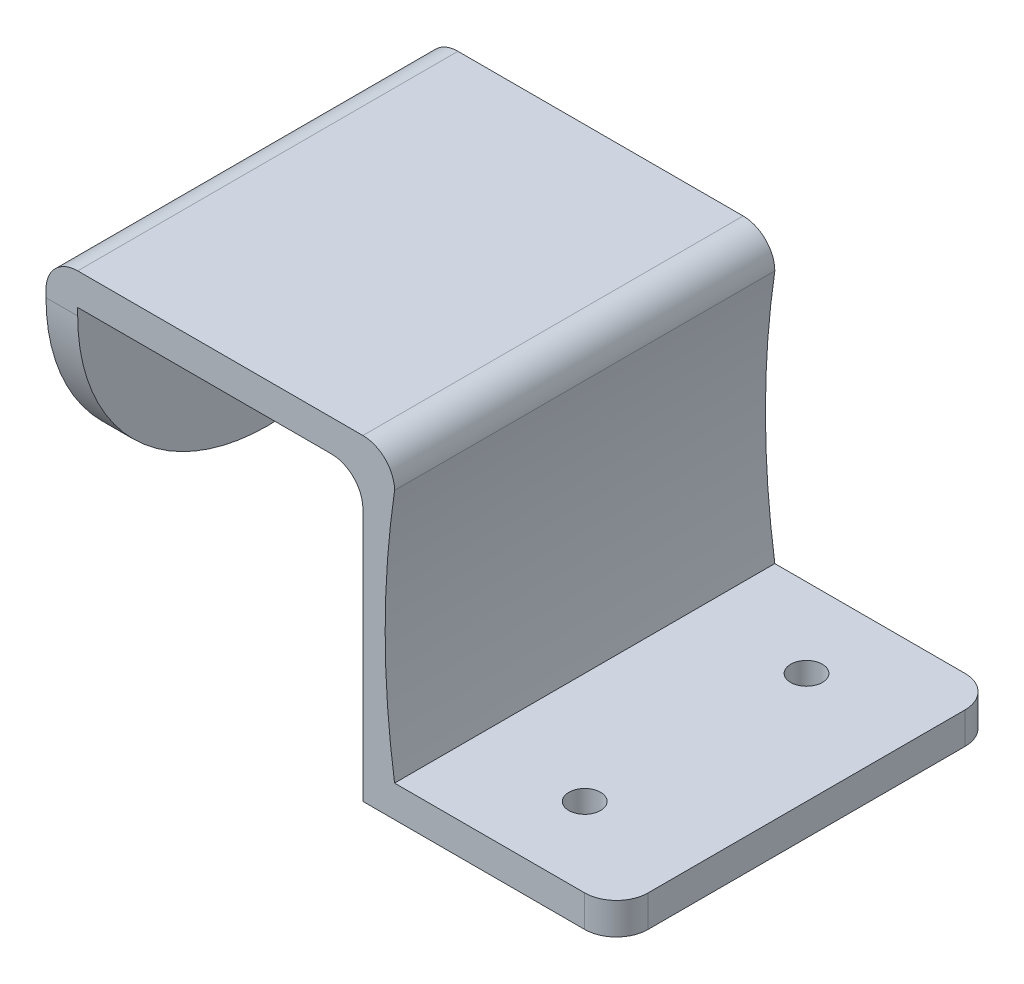
ISO-10303-21;
HEADER;
FILE_DESCRIPTION(('STEP AP214'),'2;1');
FILE_NAME('part.step','',(''),(''),'','','');
FILE_SCHEMA(('AUTOMOTIVE_DESIGN { 1 0 10303 214 1 1 1 1 }'));
ENDSEC;
DATA;
#1=APPLICATION_CONTEXT('core data for automotive mechanical design processes');
#2=APPLICATION_PROTOCOL_DEFINITION('international standard','automotive_design',2000,#1);
#3=PRODUCT_CONTEXT('',#1,'mechanical');
#4=PRODUCT('Part','Part','',(#3));
#5=PRODUCT_RELATED_PRODUCT_CATEGORY('part','',(#4));
#6=PRODUCT_DEFINITION_FORMATION('','',#4);
#7=PRODUCT_DEFINITION_CONTEXT('part definition',#1,'design');
#8=PRODUCT_DEFINITION('design','',#6,#7);
#9=PRODUCT_DEFINITION_SHAPE('','',#8);
#10=(LENGTH_UNIT() NAMED_UNIT(*) SI_UNIT(.MILLI.,.METRE.));
#11=(NAMED_UNIT(*) PLANE_ANGLE_UNIT() SI_UNIT($,.RADIAN.));
#12=(NAMED_UNIT(*) SI_UNIT($,.STERADIAN.) SOLID_ANGLE_UNIT());
#13=UNCERTAINTY_MEASURE_WITH_UNIT(LENGTH_MEASURE(1.E-05),#10,'distance_accuracy_value','');
#14=(GEOMETRIC_REPRESENTATION_CONTEXT(3) GLOBAL_UNCERTAINTY_ASSIGNED_CONTEXT((#13)) GLOBAL_UNIT_ASSIGNED_CONTEXT((#10,
#11,#12)) REPRESENTATION_CONTEXT('',''));
#15=CARTESIAN_POINT('',(0.,0.,0.));
#16=DIRECTION('',(0.,0.,1.));
#17=DIRECTION('',(1.,0.,0.));
#18=AXIS2_PLACEMENT_3D('',#15,#16,#17);
#19=CARTESIAN_POINT('',(-170.,46.9063846694511,72.));
#20=DIRECTION('',(-1.,0.,0.));
#21=DIRECTION('',(0.,0.,1.));
#22=AXIS2_PLACEMENT_3D('',#19,#20,#21);
#23=CYLINDRICAL_SURFACE('',#22,1.5);
#24=CARTESIAN_POINT('',(-170.,46.9063846694511,72.));
#25=DIRECTION('',(-1.,0.,0.));
#26=DIRECTION('',(0.,0.,1.));
#27=AXIS2_PLACEMENT_3D('',#24,#25,#26);
#28=CIRCLE('',#27,1.5);
#29=CARTESIAN_POINT('',(-170.,46.9063846694511,73.5));
#30=VERTEX_POINT('',#29);
#31=EDGE_CURVE('E297',#30,#30,#28,.T.);
#32=ORIENTED_EDGE('',*,*,#31,.F.);
#33=EDGE_LOOP('',(#32));
#34=FACE_BOUND('',#33,.T.);
#35=CARTESIAN_POINT('',(-175.,46.9063846694511,72.));
#36=DIRECTION('',(-1.,0.,0.));
#37=DIRECTION('',(0.,0.,1.));
#38=AXIS2_PLACEMENT_3D('',#35,#36,#37);
#39=CIRCLE('',#38,1.5);
#40=CARTESIAN_POINT('',(-175.,46.9063846694511,73.5));
#41=VERTEX_POINT('',#40);
#42=EDGE_CURVE('E48',#41,#41,#39,.F.);
#43=ORIENTED_EDGE('',*,*,#42,.F.);
#44=EDGE_LOOP('',(#43));
#45=FACE_BOUND('',#44,.T.);
#46=ADVANCED_FACE('F44',(#34,#45),#23,.F.);
#47=CARTESIAN_POINT('',(-170.,67.6909943602776,60.));
#48=DIRECTION('',(-1.,0.,0.));
#49=DIRECTION('',(0.,0.,1.));
#50=AXIS2_PLACEMENT_3D('',#47,#48,#49);
#51=CYLINDRICAL_SURFACE('',#50,1.5);
#52=CARTESIAN_POINT('',(-170.,67.6909943602776,60.));
#53=DIRECTION('',(-1.,0.,0.));
#54=DIRECTION('',(0.,0.,1.));
#55=AXIS2_PLACEMENT_3D('',#52,#53,#54);
#56=CIRCLE('',#55,1.5);
#57=CARTESIAN_POINT('',(-170.,67.6909943602776,61.5));
#58=VERTEX_POINT('',#57);
#59=EDGE_CURVE('E361',#58,#58,#56,.T.);
#60=ORIENTED_EDGE('',*,*,#59,.F.);
#61=EDGE_LOOP('',(#60));
#62=FACE_BOUND('',#61,.T.);
#63=CARTESIAN_POINT('',(-175.,67.6909943602776,60.));
#64=DIRECTION('',(-1.,0.,0.));
#65=DIRECTION('',(0.,0.,1.));
#66=AXIS2_PLACEMENT_3D('',#63,#64,#65);
#67=CIRCLE('',#66,1.5);
#68=CARTESIAN_POINT('',(-175.,67.6909943602776,61.5));
#69=VERTEX_POINT('',#68);
#70=EDGE_CURVE('E329',#69,#69,#67,.F.);
#71=ORIENTED_EDGE('',*,*,#70,.F.);
#72=EDGE_LOOP('',(#71));
#73=FACE_BOUND('',#72,.T.);
#74=ADVANCED_FACE('F373',(#62,#73),#51,.F.);
#75=CARTESIAN_POINT('',(-170.,46.9063846694511,48.));
#76=DIRECTION('',(-1.,0.,0.));
#77=DIRECTION('',(0.,0.,1.));
#78=AXIS2_PLACEMENT_3D('',#75,#76,#77);
#79=CYLINDRICAL_SURFACE('',#78,1.5);
#80=CARTESIAN_POINT('',(-170.,46.9063846694511,48.));
#81=DIRECTION('',(-1.,0.,0.));
#82=DIRECTION('',(0.,0.,1.));
#83=AXIS2_PLACEMENT_3D('',#80,#81,#82);
#84=CIRCLE('',#83,1.5);
#85=CARTESIAN_POINT('',(-170.,46.9063846694511,49.5));
#86=VERTEX_POINT('',#85);
#87=EDGE_CURVE('E189',#86,#86,#84,.T.);
#88=ORIENTED_EDGE('',*,*,#87,.F.);
#89=EDGE_LOOP('',(#88));
#90=FACE_BOUND('',#89,.T.);
#91=CARTESIAN_POINT('',(-175.,46.9063846694511,48.));
#92=DIRECTION('',(-1.,0.,0.));
#93=DIRECTION('',(0.,0.,1.));
#94=AXIS2_PLACEMENT_3D('',#91,#92,#93);
#95=CIRCLE('',#94,1.5);
#96=CARTESIAN_POINT('',(-175.,46.9063846694511,49.5));
#97=VERTEX_POINT('',#96);
#98=EDGE_CURVE('E326',#97,#97,#95,.F.);
#99=ORIENTED_EDGE('',*,*,#98,.F.);
#100=EDGE_LOOP('',(#99));
#101=FACE_BOUND('',#100,.T.);
#102=ADVANCED_FACE('F379',(#90,#101),#79,.F.);
#103=CARTESIAN_POINT('',(0.,0.,120.));
#104=DIRECTION('',(-1.,0.,0.));
#105=DIRECTION('',(0.,0.,1.));
#106=AXIS2_PLACEMENT_3D('',#103,#104,#105);
#107=PLANE('',#106);
#108=DIRECTION('',(0.,0.,-1.));
#109=VECTOR('',#108,1.);
#110=CARTESIAN_POINT('',(0.,0.,120.));
#111=LINE('',#110,#109);
#112=CARTESIAN_POINT('',(0.,0.,110.));
#113=VERTEX_POINT('',#112);
#114=CARTESIAN_POINT('',(0.,0.,9.99999999999999));
#115=VERTEX_POINT('',#114);
#116=EDGE_CURVE('E257',#113,#115,#111,.T.);
#117=ORIENTED_EDGE('',*,*,#116,.F.);
#118=DIRECTION('',(0.,1.,0.));
#119=VECTOR('',#118,1.);
#120=CARTESIAN_POINT('',(0.,-10.,110.));
#121=LINE('',#120,#119);
#122=CARTESIAN_POINT('',(0.,-10.,110.));
#123=VERTEX_POINT('',#122);
#124=EDGE_CURVE('E275',#113,#123,#121,.F.);
#125=ORIENTED_EDGE('',*,*,#124,.T.);
#126=DIRECTION('',(0.,0.,-1.));
#127=VECTOR('',#126,1.);
#128=CARTESIAN_POINT('',(0.,-10.,120.));
#129=LINE('',#128,#127);
#130=CARTESIAN_POINT('',(0.,-10.,9.99999999999999));
#131=VERTEX_POINT('',#130);
#132=EDGE_CURVE('E218',#123,#131,#129,.T.);
#133=ORIENTED_EDGE('',*,*,#132,.T.);
#134=DIRECTION('',(0.,1.,0.));
#135=VECTOR('',#134,1.);
#136=CARTESIAN_POINT('',(0.,0.,9.99999999999999));
#137=LINE('',#136,#135);
#138=EDGE_CURVE('E271',#131,#115,#137,.T.);
#139=ORIENTED_EDGE('',*,*,#138,.T.);
#140=EDGE_LOOP('',(#117,#125,#133,#139));
#141=FACE_BOUND('',#140,.T.);
#142=ADVANCED_FACE('F421',(#141),#107,.F.);
#143=CARTESIAN_POINT('',(0.,0.,120.));
#144=DIRECTION('',(0.,-1.,0.));
#145=DIRECTION('',(1.,0.,0.));
#146=AXIS2_PLACEMENT_3D('',#143,#144,#145);
#147=PLANE('',#146);
#148=CARTESIAN_POINT('',(-35.,0.,25.));
#149=DIRECTION('',(0.,1.,0.));
#150=DIRECTION('',(-1.,0.,0.));
#151=AXIS2_PLACEMENT_3D('',#148,#149,#150);
#152=CIRCLE('',#151,5.);
#153=CARTESIAN_POINT('',(-40.,0.,25.));
#154=VERTEX_POINT('',#153);
#155=EDGE_CURVE('E293',#154,#154,#152,.T.);
#156=ORIENTED_EDGE('',*,*,#155,.F.);
#157=EDGE_LOOP('',(#156));
#158=FACE_BOUND('',#157,.T.);
#159=CARTESIAN_POINT('',(-35.,0.,95.));
#160=DIRECTION('',(0.,1.,0.));
#161=DIRECTION('',(-1.,0.,0.));
#162=AXIS2_PLACEMENT_3D('',#159,#160,#161);
#163=CIRCLE('',#162,5.);
#164=CARTESIAN_POINT('',(-40.,0.,95.));
#165=VERTEX_POINT('',#164);
#166=EDGE_CURVE('E337',#165,#165,#163,.T.);
#167=ORIENTED_EDGE('',*,*,#166,.F.);
#168=EDGE_LOOP('',(#167));
#169=FACE_BOUND('',#168,.T.);
#170=DIRECTION('',(-1.,0.,0.));
#171=VECTOR('',#170,1.);
#172=CARTESIAN_POINT('',(0.,0.,120.));
#173=LINE('',#172,#171);
#174=CARTESIAN_POINT('',(-10.,0.,120.));
#175=VERTEX_POINT('',#174);
#176=CARTESIAN_POINT('',(-70.,0.,120.));
#177=VERTEX_POINT('',#176);
#178=EDGE_CURVE('E197',#175,#177,#173,.T.);
#179=ORIENTED_EDGE('',*,*,#178,.F.);
#180=CARTESIAN_POINT('',(-10.,0.,110.));
#181=DIRECTION('',(0.,-1.,0.));
#182=DIRECTION('',(1.,0.,0.));
#183=AXIS2_PLACEMENT_3D('',#180,#181,#182);
#184=CIRCLE('',#183,10.);
#185=EDGE_CURVE('E268',#175,#113,#184,.F.);
#186=ORIENTED_EDGE('',*,*,#185,.T.);
#187=ORIENTED_EDGE('',*,*,#116,.T.);
#188=CARTESIAN_POINT('',(-10.,0.,9.99999999999999));
#189=DIRECTION('',(0.,-1.,0.));
#190=DIRECTION('',(1.,0.,0.));
#191=AXIS2_PLACEMENT_3D('',#188,#189,#190);
#192=CIRCLE('',#191,10.);
#193=CARTESIAN_POINT('',(-10.,0.,0.));
#194=VERTEX_POINT('',#193);
#195=EDGE_CURVE('E265',#115,#194,#192,.F.);
#196=ORIENTED_EDGE('',*,*,#195,.T.);
#197=DIRECTION('',(-1.,0.,0.));
#198=VECTOR('',#197,1.);
#199=CARTESIAN_POINT('',(0.,0.,0.));
#200=LINE('',#199,#198);
#201=CARTESIAN_POINT('',(-70.,0.,0.));
#202=VERTEX_POINT('',#201);
#203=EDGE_CURVE('E173',#194,#202,#200,.T.);
#204=ORIENTED_EDGE('',*,*,#203,.T.);
#205=DIRECTION('',(0.,0.,-1.));
#206=VECTOR('',#205,1.);
#207=CARTESIAN_POINT('',(-70.,0.,120.));
#208=LINE('',#207,#206);
#209=EDGE_CURVE('E253',#177,#202,#208,.T.);
#210=ORIENTED_EDGE('',*,*,#209,.F.);
#211=EDGE_LOOP('',(#179,#186,#187,#196,#204,#210));
#212=FACE_BOUND('',#211,.T.);
#213=ADVANCED_FACE('F417',(#158,#169,#212),#147,.F.);
#214=CARTESIAN_POINT('',(198.228552940042,40.,120.));
#215=DIRECTION('',(0.,0.,-1.));
#216=DIRECTION('',(-1.,0.,0.));
#217=AXIS2_PLACEMENT_3D('',#214,#215,#216);
#218=CYLINDRICAL_SURFACE('',#217,271.194683967641);
#219=CARTESIAN_POINT('',(198.228552940042,40.,0.));
#220=DIRECTION('',(0.,0.,-1.));
#221=DIRECTION('',(1.,0.,0.));
#222=AXIS2_PLACEMENT_3D('',#219,#220,#221);
#223=CIRCLE('',#222,271.194683967641);
#224=CARTESIAN_POINT('',(-70.,79.9999999999999,0.));
#225=VERTEX_POINT('',#224);
#226=EDGE_CURVE('E221',#202,#225,#223,.T.);
#227=ORIENTED_EDGE('',*,*,#226,.T.);
#228=DIRECTION('',(0.,0.,-1.));
#229=VECTOR('',#228,1.);
#230=CARTESIAN_POINT('',(-70.,79.9999999999999,120.));
#231=LINE('',#230,#229);
#232=CARTESIAN_POINT('',(-70.,79.9999999999999,120.));
#233=VERTEX_POINT('',#232);
#234=EDGE_CURVE('E249',#233,#225,#231,.T.);
#235=ORIENTED_EDGE('',*,*,#234,.F.);
#236=CARTESIAN_POINT('',(198.228552940042,40.,120.));
#237=DIRECTION('',(0.,0.,-1.));
#238=DIRECTION('',(1.,0.,0.));
#239=AXIS2_PLACEMENT_3D('',#236,#237,#238);
#240=CIRCLE('',#239,271.194683967641);
#241=EDGE_CURVE('E200',#177,#233,#240,.T.);
#242=ORIENTED_EDGE('',*,*,#241,.F.);
#243=ORIENTED_EDGE('',*,*,#209,.T.);
#244=EDGE_LOOP('',(#227,#235,#242,#243));
#245=FACE_BOUND('',#244,.T.);
#246=ADVANCED_FACE('F414',(#245),#218,.F.);
#247=CARTESIAN_POINT('',(-70.,90.,120.));
#248=DIRECTION('',(0.,-1.,0.));
#249=DIRECTION('',(0.,0.,-1.));
#250=AXIS2_PLACEMENT_3D('',#247,#248,#249);
#251=PLANE('',#250);
#252=DIRECTION('',(-1.,0.,0.));
#253=VECTOR('',#252,1.);
#254=CARTESIAN_POINT('',(-70.,90.,0.));
#255=LINE('',#254,#253);
#256=CARTESIAN_POINT('',(-80.,90.,0.));
#257=VERTEX_POINT('',#256);
#258=CARTESIAN_POINT('',(-170.,90.,0.));
#259=VERTEX_POINT('',#258);
#260=EDGE_CURVE('E225',#257,#259,#255,.T.);
#261=ORIENTED_EDGE('',*,*,#260,.T.);
#262=DIRECTION('',(0.,0.,-1.));
#263=VECTOR('',#262,1.);
#264=CARTESIAN_POINT('',(-170.,90.,120.));
#265=LINE('',#264,#263);
#266=CARTESIAN_POINT('',(-170.,90.,120.));
#267=VERTEX_POINT('',#266);
#268=EDGE_CURVE('E54',#259,#267,#265,.F.);
#269=ORIENTED_EDGE('',*,*,#268,.T.);
#270=DIRECTION('',(-1.,0.,0.));
#271=VECTOR('',#270,1.);
#272=CARTESIAN_POINT('',(-70.,90.,120.));
#273=LINE('',#272,#271);
#274=CARTESIAN_POINT('',(-80.,90.,120.));
#275=VERTEX_POINT('',#274);
#276=EDGE_CURVE('E204',#275,#267,#273,.T.);
#277=ORIENTED_EDGE('',*,*,#276,.F.);
#278=DIRECTION('',(0.,0.,-1.));
#279=VECTOR('',#278,1.);
#280=CARTESIAN_POINT('',(-80.,90.,120.));
#281=LINE('',#280,#279);
#282=EDGE_CURVE('E287',#275,#257,#281,.T.);
#283=ORIENTED_EDGE('',*,*,#282,.T.);
#284=EDGE_LOOP('',(#261,#269,#277,#283));
#285=FACE_BOUND('',#284,.T.);
#286=ADVANCED_FACE('F410',(#285),#251,.F.);
#287=CARTESIAN_POINT('',(-80.,80.,120.));
#288=DIRECTION('',(0.,1.,0.));
#289=DIRECTION('',(-1.,0.,0.));
#290=AXIS2_PLACEMENT_3D('',#287,#288,#289);
#291=PLANE('',#290);
#292=DIRECTION('',(1.,0.,0.));
#293=VECTOR('',#292,1.);
#294=CARTESIAN_POINT('',(-80.,80.,0.));
#295=LINE('',#294,#293);
#296=CARTESIAN_POINT('',(-170.,80.,0.));
#297=VERTEX_POINT('',#296);
#298=CARTESIAN_POINT('',(-90.,80.,0.));
#299=VERTEX_POINT('',#298);
#300=EDGE_CURVE('E228',#297,#299,#295,.T.);
#301=ORIENTED_EDGE('',*,*,#300,.T.);
#302=DIRECTION('',(0.,0.,-1.));
#303=VECTOR('',#302,1.);
#304=CARTESIAN_POINT('',(-90.,80.,120.));
#305=LINE('',#304,#303);
#306=CARTESIAN_POINT('',(-90.,80.,120.));
#307=VERTEX_POINT('',#306);
#308=EDGE_CURVE('E311',#299,#307,#305,.F.);
#309=ORIENTED_EDGE('',*,*,#308,.T.);
#310=DIRECTION('',(1.,0.,0.));
#311=VECTOR('',#310,1.);
#312=CARTESIAN_POINT('',(-80.,80.,120.));
#313=LINE('',#312,#311);
#314=CARTESIAN_POINT('',(-170.,80.,120.));
#315=VERTEX_POINT('',#314);
#316=EDGE_CURVE('E207',#315,#307,#313,.T.);
#317=ORIENTED_EDGE('',*,*,#316,.F.);
#318=DIRECTION('',(0.,0.,-1.));
#319=VECTOR('',#318,1.);
#320=CARTESIAN_POINT('',(-170.,80.,120.));
#321=LINE('',#320,#319);
#322=EDGE_CURVE('E245',#315,#297,#321,.T.);
#323=ORIENTED_EDGE('',*,*,#322,.T.);
#324=EDGE_LOOP('',(#301,#309,#317,#323));
#325=FACE_BOUND('',#324,.T.);
#326=ADVANCED_FACE('F406',(#325),#291,.F.);
#327=CARTESIAN_POINT('',(-80.,-10.,120.));
#328=DIRECTION('',(1.,0.,0.));
#329=DIRECTION('',(0.,0.,-1.));
#330=AXIS2_PLACEMENT_3D('',#327,#328,#329);
#331=PLANE('',#330);
#332=DIRECTION('',(0.,-1.,0.));
#333=VECTOR('',#332,1.);
#334=CARTESIAN_POINT('',(-80.,-10.,120.));
#335=LINE('',#334,#333);
#336=CARTESIAN_POINT('',(-80.,70.,120.));
#337=VERTEX_POINT('',#336);
#338=CARTESIAN_POINT('',(-80.,-10.,120.));
#339=VERTEX_POINT('',#338);
#340=EDGE_CURVE('E211',#337,#339,#335,.T.);
#341=ORIENTED_EDGE('',*,*,#340,.F.);
#342=DIRECTION('',(0.,0.,-1.));
#343=VECTOR('',#342,1.);
#344=CARTESIAN_POINT('',(-80.,70.,0.));
#345=LINE('',#344,#343);
#346=CARTESIAN_POINT('',(-80.,70.,0.));
#347=VERTEX_POINT('',#346);
#348=EDGE_CURVE('E307',#337,#347,#345,.T.);
#349=ORIENTED_EDGE('',*,*,#348,.T.);
#350=DIRECTION('',(0.,-1.,0.));
#351=VECTOR('',#350,1.);
#352=CARTESIAN_POINT('',(-80.,-10.,0.));
#353=LINE('',#352,#351);
#354=CARTESIAN_POINT('',(-80.,-10.,0.));
#355=VERTEX_POINT('',#354);
#356=EDGE_CURVE('E232',#347,#355,#353,.T.);
#357=ORIENTED_EDGE('',*,*,#356,.T.);
#358=DIRECTION('',(0.,0.,-1.));
#359=VECTOR('',#358,1.);
#360=CARTESIAN_POINT('',(-80.,-10.,120.));
#361=LINE('',#360,#359);
#362=EDGE_CURVE('E241',#339,#355,#361,.T.);
#363=ORIENTED_EDGE('',*,*,#362,.F.);
#364=EDGE_LOOP('',(#341,#349,#357,#363));
#365=FACE_BOUND('',#364,.T.);
#366=ADVANCED_FACE('F402',(#365),#331,.F.);
#367=CARTESIAN_POINT('',(0.,-10.,120.));
#368=DIRECTION('',(0.,1.,0.));
#369=DIRECTION('',(-1.,0.,0.));
#370=AXIS2_PLACEMENT_3D('',#367,#368,#369);
#371=PLANE('',#370);
#372=CARTESIAN_POINT('',(-35.,-10.,25.));
#373=DIRECTION('',(0.,1.,0.));
#374=DIRECTION('',(-1.,0.,0.));
#375=AXIS2_PLACEMENT_3D('',#372,#373,#374);
#376=CIRCLE('',#375,5.);
#377=CARTESIAN_POINT('',(-40.,-10.,25.));
#378=VERTEX_POINT('',#377);
#379=EDGE_CURVE('E292',#378,#378,#376,.T.);
#380=ORIENTED_EDGE('',*,*,#379,.T.);
#381=EDGE_LOOP('',(#380));
#382=FACE_BOUND('',#381,.T.);
#383=CARTESIAN_POINT('',(-35.,-10.,95.));
#384=DIRECTION('',(0.,1.,0.));
#385=DIRECTION('',(-1.,0.,0.));
#386=AXIS2_PLACEMENT_3D('',#383,#384,#385);
#387=CIRCLE('',#386,5.);
#388=CARTESIAN_POINT('',(-40.,-10.,95.));
#389=VERTEX_POINT('',#388);
#390=EDGE_CURVE('E288',#389,#389,#387,.T.);
#391=ORIENTED_EDGE('',*,*,#390,.T.);
#392=EDGE_LOOP('',(#391));
#393=FACE_BOUND('',#392,.T.);
#394=ORIENTED_EDGE('',*,*,#132,.F.);
#395=CARTESIAN_POINT('',(-10.,-10.,110.));
#396=DIRECTION('',(0.,1.,0.));
#397=DIRECTION('',(-1.,0.,0.));
#398=AXIS2_PLACEMENT_3D('',#395,#396,#397);
#399=CIRCLE('',#398,10.);
#400=CARTESIAN_POINT('',(-10.,-10.,120.));
#401=VERTEX_POINT('',#400);
#402=EDGE_CURVE('E281',#123,#401,#399,.F.);
#403=ORIENTED_EDGE('',*,*,#402,.T.);
#404=DIRECTION('',(1.,0.,0.));
#405=VECTOR('',#404,1.);
#406=CARTESIAN_POINT('',(0.,-10.,120.));
#407=LINE('',#406,#405);
#408=EDGE_CURVE('E214',#339,#401,#407,.T.);
#409=ORIENTED_EDGE('',*,*,#408,.F.);
#410=ORIENTED_EDGE('',*,*,#362,.T.);
#411=DIRECTION('',(1.,0.,0.));
#412=VECTOR('',#411,1.);
#413=CARTESIAN_POINT('',(0.,-10.,0.));
#414=LINE('',#413,#412);
#415=CARTESIAN_POINT('',(-10.,-10.,0.));
#416=VERTEX_POINT('',#415);
#417=EDGE_CURVE('E201',#355,#416,#414,.T.);
#418=ORIENTED_EDGE('',*,*,#417,.T.);
#419=CARTESIAN_POINT('',(-10.,-10.,9.99999999999999));
#420=DIRECTION('',(0.,1.,0.));
#421=DIRECTION('',(-1.,0.,0.));
#422=AXIS2_PLACEMENT_3D('',#419,#420,#421);
#423=CIRCLE('',#422,10.);
#424=EDGE_CURVE('E278',#416,#131,#423,.F.);
#425=ORIENTED_EDGE('',*,*,#424,.T.);
#426=EDGE_LOOP('',(#394,#403,#409,#410,#418,#425));
#427=FACE_BOUND('',#426,.T.);
#428=ADVANCED_FACE('F396',(#382,#393,#427),#371,.F.);
#429=CARTESIAN_POINT('',(198.228552940042,40.,120.));
#430=DIRECTION('',(0.,0.,1.));
#431=DIRECTION('',(1.,0.,0.));
#432=AXIS2_PLACEMENT_3D('',#429,#430,#431);
#433=PLANE('',#432);
#434=ORIENTED_EDGE('',*,*,#276,.T.);
#435=CARTESIAN_POINT('',(-170.,80.,120.));
#436=DIRECTION('',(0.,0.,1.));
#437=DIRECTION('',(1.,0.,0.));
#438=AXIS2_PLACEMENT_3D('',#435,#436,#437);
#439=CIRCLE('',#438,10.);
#440=CARTESIAN_POINT('',(-180.,80.,120.));
#441=VERTEX_POINT('',#440);
#442=EDGE_CURVE('E11',#267,#441,#439,.T.);
#443=ORIENTED_EDGE('',*,*,#442,.T.);
#444=DIRECTION('',(0.,1.,0.));
#445=VECTOR('',#444,1.);
#446=CARTESIAN_POINT('',(-180.,77.6691757994532,120.));
#447=LINE('',#446,#445);
#448=CARTESIAN_POINT('',(-180.,77.6691757994532,120.));
#449=VERTEX_POINT('',#448);
#450=EDGE_CURVE('E180',#449,#441,#447,.T.);
#451=ORIENTED_EDGE('',*,*,#450,.F.);
#452=DIRECTION('',(1.,0.,0.));
#453=VECTOR('',#452,1.);
#454=CARTESIAN_POINT('',(-180.,77.6691757994532,120.));
#455=LINE('',#454,#453);
#456=CARTESIAN_POINT('',(-170.,77.6691757994532,120.));
#457=VERTEX_POINT('',#456);
#458=EDGE_CURVE('E174',#449,#457,#455,.T.);
#459=ORIENTED_EDGE('',*,*,#458,.T.);
#460=DIRECTION('',(0.,1.,0.));
#461=VECTOR('',#460,1.);
#462=CARTESIAN_POINT('',(-170.,77.6691757994532,120.));
#463=LINE('',#462,#461);
#464=EDGE_CURVE('E163',#457,#315,#463,.T.);
#465=ORIENTED_EDGE('',*,*,#464,.T.);
#466=ORIENTED_EDGE('',*,*,#316,.T.);
#467=CARTESIAN_POINT('',(-90.,70.,120.));
#468=DIRECTION('',(0.,0.,1.));
#469=DIRECTION('',(1.,0.,0.));
#470=AXIS2_PLACEMENT_3D('',#467,#468,#469);
#471=CIRCLE('',#470,10.);
#472=EDGE_CURVE('E317',#307,#337,#471,.F.);
#473=ORIENTED_EDGE('',*,*,#472,.T.);
#474=ORIENTED_EDGE('',*,*,#340,.T.);
#475=ORIENTED_EDGE('',*,*,#408,.T.);
#476=DIRECTION('',(0.,1.,0.));
#477=VECTOR('',#476,1.);
#478=CARTESIAN_POINT('',(-10.,0.,120.));
#479=LINE('',#478,#477);
#480=EDGE_CURVE('E261',#401,#175,#479,.T.);
#481=ORIENTED_EDGE('',*,*,#480,.T.);
#482=ORIENTED_EDGE('',*,*,#178,.T.);
#483=ORIENTED_EDGE('',*,*,#241,.T.);
#484=CARTESIAN_POINT('',(-80.,80.,120.));
#485=DIRECTION('',(0.,0.,1.));
#486=DIRECTION('',(1.,0.,0.));
#487=AXIS2_PLACEMENT_3D('',#484,#485,#486);
#488=CIRCLE('',#487,10.);
#489=EDGE_CURVE('E304',#233,#275,#488,.T.);
#490=ORIENTED_EDGE('',*,*,#489,.T.);
#491=EDGE_LOOP('',(#434,#443,#451,#459,#465,#466,#473,#474,#475,#481,#482,#483,#490));
#492=FACE_BOUND('',#491,.T.);
#493=ADVANCED_FACE('F393',(#492),#433,.T.);
#494=CARTESIAN_POINT('',(198.228552940042,40.,0.));
#495=DIRECTION('',(0.,0.,1.));
#496=DIRECTION('',(1.,0.,0.));
#497=AXIS2_PLACEMENT_3D('',#494,#495,#496);
#498=PLANE('',#497);
#499=DIRECTION('',(0.,-1.,0.));
#500=VECTOR('',#499,1.);
#501=CARTESIAN_POINT('',(-180.,89.9999999999999,0.));
#502=LINE('',#501,#500);
#503=CARTESIAN_POINT('',(-180.,80.,0.));
#504=VERTEX_POINT('',#503);
#505=CARTESIAN_POINT('',(-180.,77.6691757994532,0.));
#506=VERTEX_POINT('',#505);
#507=EDGE_CURVE('E153',#504,#506,#502,.T.);
#508=ORIENTED_EDGE('',*,*,#507,.F.);
#509=CARTESIAN_POINT('',(-170.,80.,0.));
#510=DIRECTION('',(0.,0.,1.));
#511=DIRECTION('',(1.,0.,0.));
#512=AXIS2_PLACEMENT_3D('',#509,#510,#511);
#513=CIRCLE('',#512,10.);
#514=EDGE_CURVE('E69',#504,#259,#513,.F.);
#515=ORIENTED_EDGE('',*,*,#514,.T.);
#516=ORIENTED_EDGE('',*,*,#260,.F.);
#517=CARTESIAN_POINT('',(-80.,80.,0.));
#518=DIRECTION('',(0.,0.,1.));
#519=DIRECTION('',(1.,0.,0.));
#520=AXIS2_PLACEMENT_3D('',#517,#518,#519);
#521=CIRCLE('',#520,10.);
#522=EDGE_CURVE('E301',#257,#225,#521,.F.);
#523=ORIENTED_EDGE('',*,*,#522,.T.);
#524=ORIENTED_EDGE('',*,*,#226,.F.);
#525=ORIENTED_EDGE('',*,*,#203,.F.);
#526=DIRECTION('',(0.,1.,0.));
#527=VECTOR('',#526,1.);
#528=CARTESIAN_POINT('',(-10.,40.,0.));
#529=LINE('',#528,#527);
#530=EDGE_CURVE('E284',#194,#416,#529,.F.);
#531=ORIENTED_EDGE('',*,*,#530,.T.);
#532=ORIENTED_EDGE('',*,*,#417,.F.);
#533=ORIENTED_EDGE('',*,*,#356,.F.);
#534=CARTESIAN_POINT('',(-90.,70.,0.));
#535=DIRECTION('',(0.,0.,1.));
#536=DIRECTION('',(1.,0.,0.));
#537=AXIS2_PLACEMENT_3D('',#534,#535,#536);
#538=CIRCLE('',#537,10.);
#539=EDGE_CURVE('E314',#347,#299,#538,.T.);
#540=ORIENTED_EDGE('',*,*,#539,.T.);
#541=ORIENTED_EDGE('',*,*,#300,.F.);
#542=DIRECTION('',(0.,-1.,0.));
#543=VECTOR('',#542,1.);
#544=CARTESIAN_POINT('',(-170.,80.,0.));
#545=LINE('',#544,#543);
#546=CARTESIAN_POINT('',(-170.,77.6691757994532,0.));
#547=VERTEX_POINT('',#546);
#548=EDGE_CURVE('E169',#297,#547,#545,.T.);
#549=ORIENTED_EDGE('',*,*,#548,.T.);
#550=DIRECTION('',(1.,0.,0.));
#551=VECTOR('',#550,1.);
#552=CARTESIAN_POINT('',(-180.,77.6691757994532,0.));
#553=LINE('',#552,#551);
#554=EDGE_CURVE('E166',#506,#547,#553,.T.);
#555=ORIENTED_EDGE('',*,*,#554,.F.);
#556=EDGE_LOOP('',(#508,#515,#516,#523,#524,#525,#531,#532,#533,#540,#541,#549,#555));
#557=FACE_BOUND('',#556,.T.);
#558=ADVANCED_FACE('F167',(#557),#498,.F.);
#559=CARTESIAN_POINT('',(-180.,77.6691757994532,60.));
#560=DIRECTION('',(1.,0.,0.));
#561=DIRECTION('',(0.,0.,-1.));
#562=AXIS2_PLACEMENT_3D('',#559,#560,#561);
#563=CYLINDRICAL_SURFACE('',#562,60.);
#564=CARTESIAN_POINT('',(-170.,77.6691757994532,60.));
#565=DIRECTION('',(-1.,0.,0.));
#566=DIRECTION('',(0.,0.,1.));
#567=AXIS2_PLACEMENT_3D('',#564,#565,#566);
#568=CIRCLE('',#567,60.);
#569=EDGE_CURVE('E188',#547,#457,#568,.T.);
#570=ORIENTED_EDGE('',*,*,#569,.T.);
#571=ORIENTED_EDGE('',*,*,#458,.F.);
#572=CARTESIAN_POINT('',(-180.,77.6691757994532,60.));
#573=DIRECTION('',(-1.,0.,0.));
#574=DIRECTION('',(0.,0.,1.));
#575=AXIS2_PLACEMENT_3D('',#572,#573,#574);
#576=CIRCLE('',#575,60.);
#577=EDGE_CURVE('E158',#506,#449,#576,.T.);
#578=ORIENTED_EDGE('',*,*,#577,.F.);
#579=ORIENTED_EDGE('',*,*,#554,.T.);
#580=EDGE_LOOP('',(#570,#571,#578,#579));
#581=FACE_BOUND('',#580,.T.);
#582=ADVANCED_FACE('F176',(#581),#563,.T.);
#583=CARTESIAN_POINT('',(-180.,77.6691757994532,60.));
#584=DIRECTION('',(-1.,0.,0.));
#585=DIRECTION('',(0.,0.,1.));
#586=AXIS2_PLACEMENT_3D('',#583,#584,#585);
#587=PLANE('',#586);
#588=CARTESIAN_POINT('',(-180.,46.9063846694511,72.));
#589=DIRECTION('',(-1.,0.,0.));
#590=DIRECTION('',(0.,0.,1.));
#591=AXIS2_PLACEMENT_3D('',#588,#589,#590);
#592=CIRCLE('',#591,2.50000000000001);
#593=CARTESIAN_POINT('',(-180.,46.9063846694511,74.5));
#594=VERTEX_POINT('',#593);
#595=EDGE_CURVE('E686',#594,#594,#592,.T.);
#596=ORIENTED_EDGE('',*,*,#595,.F.);
#597=EDGE_LOOP('',(#596));
#598=FACE_BOUND('',#597,.T.);
#599=CARTESIAN_POINT('',(-180.,67.6909943602776,60.));
#600=DIRECTION('',(-1.,0.,0.));
#601=DIRECTION('',(0.,0.,1.));
#602=AXIS2_PLACEMENT_3D('',#599,#600,#601);
#603=CIRCLE('',#602,2.5);
#604=CARTESIAN_POINT('',(-180.,67.6909943602776,62.5));
#605=VERTEX_POINT('',#604);
#606=EDGE_CURVE('E688',#605,#605,#603,.T.);
#607=ORIENTED_EDGE('',*,*,#606,.F.);
#608=EDGE_LOOP('',(#607));
#609=FACE_BOUND('',#608,.T.);
#610=CARTESIAN_POINT('',(-180.,46.9063846694511,48.));
#611=DIRECTION('',(-1.,0.,0.));
#612=DIRECTION('',(0.,0.,1.));
#613=AXIS2_PLACEMENT_3D('',#610,#611,#612);
#614=CIRCLE('',#613,2.5);
#615=CARTESIAN_POINT('',(-180.,46.9063846694511,50.5));
#616=VERTEX_POINT('',#615);
#617=EDGE_CURVE('E700',#616,#616,#614,.T.);
#618=ORIENTED_EDGE('',*,*,#617,.F.);
#619=EDGE_LOOP('',(#618));
#620=FACE_BOUND('',#619,.T.);
#621=CARTESIAN_POINT('',(-180.,53.8345878997266,60.));
#622=DIRECTION('',(-1.,0.,0.));
#623=DIRECTION('',(0.,0.,1.));
#624=AXIS2_PLACEMENT_3D('',#621,#622,#623);
#625=CIRCLE('',#624,9.25000000000002);
#626=CARTESIAN_POINT('',(-180.,53.8345878997266,69.25));
#627=VERTEX_POINT('',#626);
#628=EDGE_CURVE('E353',#627,#627,#625,.T.);
#629=ORIENTED_EDGE('',*,*,#628,.F.);
#630=EDGE_LOOP('',(#629));
#631=FACE_BOUND('',#630,.T.);
#632=ORIENTED_EDGE('',*,*,#450,.T.);
#633=DIRECTION('',(0.,0.,-1.));
#634=VECTOR('',#633,1.);
#635=CARTESIAN_POINT('',(-180.,80.,0.));
#636=LINE('',#635,#634);
#637=EDGE_CURVE('E161',#441,#504,#636,.T.);
#638=ORIENTED_EDGE('',*,*,#637,.T.);
#639=ORIENTED_EDGE('',*,*,#507,.T.);
#640=ORIENTED_EDGE('',*,*,#577,.T.);
#641=EDGE_LOOP('',(#632,#638,#639,#640));
#642=FACE_BOUND('',#641,.T.);
#643=ADVANCED_FACE('F156',(#598,#609,#620,#631,#642),#587,.T.);
#644=CARTESIAN_POINT('',(-170.,77.6691757994532,60.));
#645=DIRECTION('',(-1.,0.,0.));
#646=DIRECTION('',(0.,0.,1.));
#647=AXIS2_PLACEMENT_3D('',#644,#645,#646);
#648=PLANE('',#647);
#649=ORIENTED_EDGE('',*,*,#87,.T.);
#650=EDGE_LOOP('',(#649));
#651=FACE_BOUND('',#650,.T.);
#652=CARTESIAN_POINT('',(-170.,53.8345878997266,60.));
#653=DIRECTION('',(-1.,0.,0.));
#654=DIRECTION('',(0.,0.,1.));
#655=AXIS2_PLACEMENT_3D('',#652,#653,#654);
#656=CIRCLE('',#655,9.25000000000002);
#657=CARTESIAN_POINT('',(-170.,53.8345878997266,69.25));
#658=VERTEX_POINT('',#657);
#659=EDGE_CURVE('E357',#658,#658,#656,.T.);
#660=ORIENTED_EDGE('',*,*,#659,.T.);
#661=EDGE_LOOP('',(#660));
#662=FACE_BOUND('',#661,.T.);
#663=ORIENTED_EDGE('',*,*,#59,.T.);
#664=EDGE_LOOP('',(#663));
#665=FACE_BOUND('',#664,.T.);
#666=ORIENTED_EDGE('',*,*,#31,.T.);
#667=EDGE_LOOP('',(#666));
#668=FACE_BOUND('',#667,.T.);
#669=ORIENTED_EDGE('',*,*,#322,.F.);
#670=ORIENTED_EDGE('',*,*,#464,.F.);
#671=ORIENTED_EDGE('',*,*,#569,.F.);
#672=ORIENTED_EDGE('',*,*,#548,.F.);
#673=EDGE_LOOP('',(#669,#670,#671,#672));
#674=FACE_BOUND('',#673,.T.);
#675=ADVANCED_FACE('F368',(#651,#662,#665,#668,#674),#648,.F.);
#676=CARTESIAN_POINT('',(-170.,53.8345878997266,60.));
#677=DIRECTION('',(-1.,0.,0.));
#678=DIRECTION('',(0.,0.,1.));
#679=AXIS2_PLACEMENT_3D('',#676,#677,#678);
#680=CYLINDRICAL_SURFACE('',#679,9.25000000000002);
#681=ORIENTED_EDGE('',*,*,#659,.F.);
#682=EDGE_LOOP('',(#681));
#683=FACE_BOUND('',#682,.T.);
#684=ORIENTED_EDGE('',*,*,#628,.T.);
#685=EDGE_LOOP('',(#684));
#686=FACE_BOUND('',#685,.T.);
#687=ADVANCED_FACE('F389',(#683,#686),#680,.F.);
#688=CARTESIAN_POINT('',(-10.,40.,110.));
#689=DIRECTION('',(0.,-1.,0.));
#690=DIRECTION('',(0.,0.,-1.));
#691=AXIS2_PLACEMENT_3D('',#688,#689,#690);
#692=CYLINDRICAL_SURFACE('',#691,10.);
#693=ORIENTED_EDGE('',*,*,#402,.F.);
#694=ORIENTED_EDGE('',*,*,#124,.F.);
#695=ORIENTED_EDGE('',*,*,#185,.F.);
#696=ORIENTED_EDGE('',*,*,#480,.F.);
#697=EDGE_LOOP('',(#693,#694,#695,#696));
#698=FACE_BOUND('',#697,.T.);
#699=ADVANCED_FACE('F426',(#698),#692,.T.);
#700=CARTESIAN_POINT('',(-10.,0.,9.99999999999999));
#701=DIRECTION('',(0.,1.,0.));
#702=DIRECTION('',(0.,0.,1.));
#703=AXIS2_PLACEMENT_3D('',#700,#701,#702);
#704=CYLINDRICAL_SURFACE('',#703,10.);
#705=ORIENTED_EDGE('',*,*,#424,.F.);
#706=ORIENTED_EDGE('',*,*,#530,.F.);
#707=ORIENTED_EDGE('',*,*,#195,.F.);
#708=ORIENTED_EDGE('',*,*,#138,.F.);
#709=EDGE_LOOP('',(#705,#706,#707,#708));
#710=FACE_BOUND('',#709,.T.);
#711=ADVANCED_FACE('F429',(#710),#704,.T.);
#712=CARTESIAN_POINT('',(-35.,-20.,95.));
#713=DIRECTION('',(0.,1.,0.));
#714=DIRECTION('',(-1.,0.,0.));
#715=AXIS2_PLACEMENT_3D('',#712,#713,#714);
#716=CYLINDRICAL_SURFACE('',#715,5.);
#717=ORIENTED_EDGE('',*,*,#166,.T.);
#718=EDGE_LOOP('',(#717));
#719=FACE_BOUND('',#718,.T.);
#720=ORIENTED_EDGE('',*,*,#390,.F.);
#721=EDGE_LOOP('',(#720));
#722=FACE_BOUND('',#721,.T.);
#723=ADVANCED_FACE('F433',(#719,#722),#716,.F.);
#724=CARTESIAN_POINT('',(-35.,-20.,25.));
#725=DIRECTION('',(0.,1.,0.));
#726=DIRECTION('',(-1.,0.,0.));
#727=AXIS2_PLACEMENT_3D('',#724,#725,#726);
#728=CYLINDRICAL_SURFACE('',#727,5.);
#729=ORIENTED_EDGE('',*,*,#155,.T.);
#730=EDGE_LOOP('',(#729));
#731=FACE_BOUND('',#730,.T.);
#732=ORIENTED_EDGE('',*,*,#379,.F.);
#733=EDGE_LOOP('',(#732));
#734=FACE_BOUND('',#733,.T.);
#735=ADVANCED_FACE('F438',(#731,#734),#728,.F.);
#736=CARTESIAN_POINT('',(-80.,80.,120.));
#737=DIRECTION('',(0.,0.,-1.));
#738=DIRECTION('',(-1.,0.,0.));
#739=AXIS2_PLACEMENT_3D('',#736,#737,#738);
#740=CYLINDRICAL_SURFACE('',#739,10.);
#741=ORIENTED_EDGE('',*,*,#489,.F.);
#742=ORIENTED_EDGE('',*,*,#234,.T.);
#743=ORIENTED_EDGE('',*,*,#522,.F.);
#744=ORIENTED_EDGE('',*,*,#282,.F.);
#745=EDGE_LOOP('',(#741,#742,#743,#744));
#746=FACE_BOUND('',#745,.T.);
#747=ADVANCED_FACE('F435',(#746),#740,.T.);
#748=CARTESIAN_POINT('',(-90.,70.,120.));
#749=DIRECTION('',(0.,0.,1.));
#750=DIRECTION('',(1.,0.,0.));
#751=AXIS2_PLACEMENT_3D('',#748,#749,#750);
#752=CYLINDRICAL_SURFACE('',#751,10.);
#753=ORIENTED_EDGE('',*,*,#472,.F.);
#754=ORIENTED_EDGE('',*,*,#308,.F.);
#755=ORIENTED_EDGE('',*,*,#539,.F.);
#756=ORIENTED_EDGE('',*,*,#348,.F.);
#757=EDGE_LOOP('',(#753,#754,#755,#756));
#758=FACE_BOUND('',#757,.T.);
#759=ADVANCED_FACE('F437',(#758),#752,.F.);
#760=CARTESIAN_POINT('',(-170.,80.,60.));
#761=DIRECTION('',(0.,0.,1.));
#762=DIRECTION('',(1.,0.,0.));
#763=AXIS2_PLACEMENT_3D('',#760,#761,#762);
#764=CYLINDRICAL_SURFACE('',#763,10.);
#765=ORIENTED_EDGE('',*,*,#442,.F.);
#766=ORIENTED_EDGE('',*,*,#268,.F.);
#767=ORIENTED_EDGE('',*,*,#514,.F.);
#768=ORIENTED_EDGE('',*,*,#637,.F.);
#769=EDGE_LOOP('',(#765,#766,#767,#768));
#770=FACE_BOUND('',#769,.T.);
#771=ADVANCED_FACE('F46',(#770),#764,.T.);
#772=CARTESIAN_POINT('',(-175.,46.9063846694511,48.));
#773=DIRECTION('',(-1.,0.,0.));
#774=DIRECTION('',(0.,0.,1.));
#775=AXIS2_PLACEMENT_3D('',#772,#773,#774);
#776=PLANE('',#775);
#777=CARTESIAN_POINT('',(-175.,46.9063846694511,48.));
#778=DIRECTION('',(-1.,0.,0.));
#779=DIRECTION('',(0.,0.,1.));
#780=AXIS2_PLACEMENT_3D('',#777,#778,#779);
#781=CIRCLE('',#780,2.5);
#782=CARTESIAN_POINT('',(-175.,46.9063846694511,50.5));
#783=VERTEX_POINT('',#782);
#784=EDGE_CURVE('E703',#783,#783,#781,.T.);
#785=ORIENTED_EDGE('',*,*,#784,.T.);
#786=EDGE_LOOP('',(#785));
#787=FACE_BOUND('',#786,.T.);
#788=ORIENTED_EDGE('',*,*,#98,.T.);
#789=EDGE_LOOP('',(#788));
#790=FACE_BOUND('',#789,.T.);
#791=ADVANCED_FACE('F444',(#787,#790),#776,.T.);
#792=CARTESIAN_POINT('',(-175.,46.9063846694511,48.));
#793=DIRECTION('',(-1.,0.,0.));
#794=DIRECTION('',(0.,0.,1.));
#795=AXIS2_PLACEMENT_3D('',#792,#793,#794);
#796=CYLINDRICAL_SURFACE('',#795,2.5);
#797=ORIENTED_EDGE('',*,*,#784,.F.);
#798=EDGE_LOOP('',(#797));
#799=FACE_BOUND('',#798,.T.);
#800=ORIENTED_EDGE('',*,*,#617,.T.);
#801=EDGE_LOOP('',(#800));
#802=FACE_BOUND('',#801,.T.);
#803=ADVANCED_FACE('F478',(#799,#802),#796,.F.);
#804=CARTESIAN_POINT('',(-175.,67.6909943602776,60.));
#805=DIRECTION('',(-1.,0.,0.));
#806=DIRECTION('',(0.,0.,1.));
#807=AXIS2_PLACEMENT_3D('',#804,#805,#806);
#808=PLANE('',#807);
#809=CARTESIAN_POINT('',(-175.,67.6909943602776,60.));
#810=DIRECTION('',(-1.,0.,0.));
#811=DIRECTION('',(0.,0.,1.));
#812=AXIS2_PLACEMENT_3D('',#809,#810,#811);
#813=CIRCLE('',#812,2.5);
#814=CARTESIAN_POINT('',(-175.,67.6909943602776,62.5));
#815=VERTEX_POINT('',#814);
#816=EDGE_CURVE('E694',#815,#815,#813,.T.);
#817=ORIENTED_EDGE('',*,*,#816,.T.);
#818=EDGE_LOOP('',(#817));
#819=FACE_BOUND('',#818,.T.);
#820=ORIENTED_EDGE('',*,*,#70,.T.);
#821=EDGE_LOOP('',(#820));
#822=FACE_BOUND('',#821,.T.);
#823=ADVANCED_FACE('F484',(#819,#822),#808,.T.);
#824=CARTESIAN_POINT('',(-175.,67.6909943602776,60.));
#825=DIRECTION('',(-1.,0.,0.));
#826=DIRECTION('',(0.,0.,1.));
#827=AXIS2_PLACEMENT_3D('',#824,#825,#826);
#828=CYLINDRICAL_SURFACE('',#827,2.5);
#829=ORIENTED_EDGE('',*,*,#816,.F.);
#830=EDGE_LOOP('',(#829));
#831=FACE_BOUND('',#830,.T.);
#832=ORIENTED_EDGE('',*,*,#606,.T.);
#833=EDGE_LOOP('',(#832));
#834=FACE_BOUND('',#833,.T.);
#835=ADVANCED_FACE('F647',(#831,#834),#828,.F.);
#836=CARTESIAN_POINT('',(-175.,46.9063846694511,72.));
#837=DIRECTION('',(-1.,0.,0.));
#838=DIRECTION('',(0.,0.,1.));
#839=AXIS2_PLACEMENT_3D('',#836,#837,#838);
#840=PLANE('',#839);
#841=CARTESIAN_POINT('',(-175.,46.9063846694511,72.));
#842=DIRECTION('',(-1.,0.,0.));
#843=DIRECTION('',(0.,0.,1.));
#844=AXIS2_PLACEMENT_3D('',#841,#842,#843);
#845=CIRCLE('',#844,2.50000000000001);
#846=CARTESIAN_POINT('',(-175.,46.9063846694511,74.5));
#847=VERTEX_POINT('',#846);
#848=EDGE_CURVE('E330',#847,#847,#845,.T.);
#849=ORIENTED_EDGE('',*,*,#848,.T.);
#850=EDGE_LOOP('',(#849));
#851=FACE_BOUND('',#850,.T.);
#852=ORIENTED_EDGE('',*,*,#42,.T.);
#853=EDGE_LOOP('',(#852));
#854=FACE_BOUND('',#853,.T.);
#855=ADVANCED_FACE('F655',(#851,#854),#840,.T.);
#856=CARTESIAN_POINT('',(-175.,46.9063846694511,72.));
#857=DIRECTION('',(-1.,0.,0.));
#858=DIRECTION('',(0.,0.,1.));
#859=AXIS2_PLACEMENT_3D('',#856,#857,#858);
#860=CYLINDRICAL_SURFACE('',#859,2.50000000000001);
#861=ORIENTED_EDGE('',*,*,#848,.F.);
#862=EDGE_LOOP('',(#861));
#863=FACE_BOUND('',#862,.T.);
#864=ORIENTED_EDGE('',*,*,#595,.T.);
#865=EDGE_LOOP('',(#864));
#866=FACE_BOUND('',#865,.T.);
#867=ADVANCED_FACE('F664',(#863,#866),#860,.F.);
#868=CLOSED_SHELL('',(#46,#74,#102,#142,#213,#246,#286,#326,#366,#428,#493,#558,#582,#643,#675,
#687,#699,#711,#723,#735,#747,#759,#771,#791,#803,#823,#835,#855,#867));
#869=MANIFOLD_SOLID_BREP('B2',#868);
#870=ADVANCED_BREP_SHAPE_REPRESENTATION('',(#18,#869),#14);
#871=SHAPE_DEFINITION_REPRESENTATION(#9,#870);
ENDSEC;
END-ISO-10303-21;
